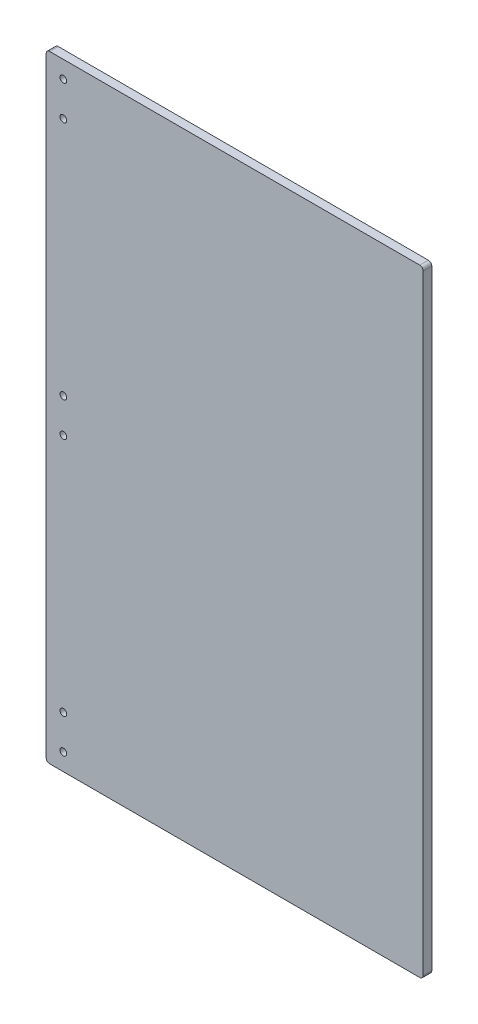
ISO-10303-21;
HEADER;
FILE_DESCRIPTION(('STEP AP214'),'2;1');
FILE_NAME('part.step','',(''),(''),'','','');
FILE_SCHEMA(('AUTOMOTIVE_DESIGN { 1 0 10303 214 1 1 1 1 }'));
ENDSEC;
DATA;
#1=APPLICATION_CONTEXT('core data for automotive mechanical design processes');
#2=APPLICATION_PROTOCOL_DEFINITION('international standard','automotive_design',2000,#1);
#3=PRODUCT_CONTEXT('',#1,'mechanical');
#4=PRODUCT('Part','Part','',(#3));
#5=PRODUCT_RELATED_PRODUCT_CATEGORY('part','',(#4));
#6=PRODUCT_DEFINITION_FORMATION('','',#4);
#7=PRODUCT_DEFINITION_CONTEXT('part definition',#1,'design');
#8=PRODUCT_DEFINITION('design','',#6,#7);
#9=PRODUCT_DEFINITION_SHAPE('','',#8);
#10=(LENGTH_UNIT() NAMED_UNIT(*) SI_UNIT(.MILLI.,.METRE.));
#11=(NAMED_UNIT(*) PLANE_ANGLE_UNIT() SI_UNIT($,.RADIAN.));
#12=(NAMED_UNIT(*) SI_UNIT($,.STERADIAN.) SOLID_ANGLE_UNIT());
#13=UNCERTAINTY_MEASURE_WITH_UNIT(LENGTH_MEASURE(1.E-05),#10,'distance_accuracy_value','');
#14=(GEOMETRIC_REPRESENTATION_CONTEXT(3) GLOBAL_UNCERTAINTY_ASSIGNED_CONTEXT((#13)) GLOBAL_UNIT_ASSIGNED_CONTEXT((#10,
#11,#12)) REPRESENTATION_CONTEXT('',''));
#15=CARTESIAN_POINT('',(0.,0.,0.));
#16=DIRECTION('',(0.,0.,1.));
#17=DIRECTION('',(1.,0.,0.));
#18=AXIS2_PLACEMENT_3D('',#15,#16,#17);
#19=CARTESIAN_POINT('',(0.,0.,6.35));
#20=DIRECTION('',(0.,0.,-1.));
#21=DIRECTION('',(-1.,0.,0.));
#22=AXIS2_PLACEMENT_3D('',#19,#20,#21);
#23=PLANE('',#22);
#24=DIRECTION('',(-1.,0.,0.));
#25=VECTOR('',#24,1.);
#26=CARTESIAN_POINT('',(0.,457.2,6.35));
#27=LINE('',#26,#25);
#28=CARTESIAN_POINT('',(276.86,457.2,6.35));
#29=VERTEX_POINT('',#28);
#30=CARTESIAN_POINT('',(2.53999999999992,457.2,6.35));
#31=VERTEX_POINT('',#30);
#32=EDGE_CURVE('E136',#29,#31,#27,.T.);
#33=ORIENTED_EDGE('',*,*,#32,.T.);
#34=CARTESIAN_POINT('',(2.53999999999992,454.66,6.35));
#35=DIRECTION('',(0.,0.,-1.));
#36=DIRECTION('',(-1.,0.,0.));
#37=AXIS2_PLACEMENT_3D('',#34,#35,#36);
#38=CIRCLE('',#37,2.54);
#39=CARTESIAN_POINT('',(0.,454.66,6.35));
#40=VERTEX_POINT('',#39);
#41=EDGE_CURVE('E155',#31,#40,#38,.F.);
#42=ORIENTED_EDGE('',*,*,#41,.T.);
#43=DIRECTION('',(0.,-1.,0.));
#44=VECTOR('',#43,1.);
#45=CARTESIAN_POINT('',(0.,0.,6.35));
#46=LINE('',#45,#44);
#47=CARTESIAN_POINT('',(0.,2.54,6.35));
#48=VERTEX_POINT('',#47);
#49=EDGE_CURVE('E119',#40,#48,#46,.T.);
#50=ORIENTED_EDGE('',*,*,#49,.T.);
#51=CARTESIAN_POINT('',(2.54,2.54,6.35));
#52=DIRECTION('',(0.,0.,-1.));
#53=DIRECTION('',(-1.,0.,0.));
#54=AXIS2_PLACEMENT_3D('',#51,#52,#53);
#55=CIRCLE('',#54,2.54);
#56=CARTESIAN_POINT('',(2.54,0.,6.35));
#57=VERTEX_POINT('',#56);
#58=EDGE_CURVE('E153',#48,#57,#55,.F.);
#59=ORIENTED_EDGE('',*,*,#58,.T.);
#60=DIRECTION('',(1.,0.,0.));
#61=VECTOR('',#60,1.);
#62=CARTESIAN_POINT('',(0.,0.,6.35));
#63=LINE('',#62,#61);
#64=CARTESIAN_POINT('',(276.86,0.,6.35));
#65=VERTEX_POINT('',#64);
#66=EDGE_CURVE('E166',#57,#65,#63,.T.);
#67=ORIENTED_EDGE('',*,*,#66,.T.);
#68=CARTESIAN_POINT('',(276.86,2.54,6.35));
#69=DIRECTION('',(0.,0.,-1.));
#70=DIRECTION('',(-1.,0.,0.));
#71=AXIS2_PLACEMENT_3D('',#68,#69,#70);
#72=CIRCLE('',#71,2.54);
#73=CARTESIAN_POINT('',(279.4,2.54,6.35));
#74=VERTEX_POINT('',#73);
#75=EDGE_CURVE('E54',#65,#74,#72,.F.);
#76=ORIENTED_EDGE('',*,*,#75,.T.);
#77=DIRECTION('',(0.,1.,0.));
#78=VECTOR('',#77,1.);
#79=CARTESIAN_POINT('',(279.4,0.,6.35));
#80=LINE('',#79,#78);
#81=CARTESIAN_POINT('',(279.4,454.66,6.35));
#82=VERTEX_POINT('',#81);
#83=EDGE_CURVE('E174',#74,#82,#80,.T.);
#84=ORIENTED_EDGE('',*,*,#83,.T.);
#85=CARTESIAN_POINT('',(276.86,454.66,6.35));
#86=DIRECTION('',(0.,0.,-1.));
#87=DIRECTION('',(-1.,0.,0.));
#88=AXIS2_PLACEMENT_3D('',#85,#86,#87);
#89=CIRCLE('',#88,2.54);
#90=EDGE_CURVE('E150',#82,#29,#89,.F.);
#91=ORIENTED_EDGE('',*,*,#90,.T.);
#92=EDGE_LOOP('',(#33,#42,#50,#59,#67,#76,#84,#91));
#93=FACE_BOUND('',#92,.T.);
#94=CARTESIAN_POINT('',(12.6999999999999,444.5,6.35));
#95=DIRECTION('',(0.,0.,1.));
#96=DIRECTION('',(1.,0.,0.));
#97=AXIS2_PLACEMENT_3D('',#94,#95,#96);
#98=CIRCLE('',#97,2.5);
#99=CARTESIAN_POINT('',(15.1999999999999,444.5,6.35));
#100=VERTEX_POINT('',#99);
#101=EDGE_CURVE('E127',#100,#100,#98,.T.);
#102=ORIENTED_EDGE('',*,*,#101,.F.);
#103=EDGE_LOOP('',(#102));
#104=FACE_BOUND('',#103,.T.);
#105=CARTESIAN_POINT('',(12.6999999999999,419.1,6.35));
#106=DIRECTION('',(0.,0.,1.));
#107=DIRECTION('',(1.,0.,0.));
#108=AXIS2_PLACEMENT_3D('',#105,#106,#107);
#109=CIRCLE('',#108,2.5);
#110=CARTESIAN_POINT('',(15.1999999999999,419.1,6.35));
#111=VERTEX_POINT('',#110);
#112=EDGE_CURVE('E181',#111,#111,#109,.T.);
#113=ORIENTED_EDGE('',*,*,#112,.F.);
#114=EDGE_LOOP('',(#113));
#115=FACE_BOUND('',#114,.T.);
#116=CARTESIAN_POINT('',(12.6999999999999,241.3,6.35));
#117=DIRECTION('',(0.,0.,1.));
#118=DIRECTION('',(1.,0.,0.));
#119=AXIS2_PLACEMENT_3D('',#116,#117,#118);
#120=CIRCLE('',#119,2.5);
#121=CARTESIAN_POINT('',(15.1999999999999,241.3,6.35));
#122=VERTEX_POINT('',#121);
#123=EDGE_CURVE('E186',#122,#122,#120,.T.);
#124=ORIENTED_EDGE('',*,*,#123,.F.);
#125=EDGE_LOOP('',(#124));
#126=FACE_BOUND('',#125,.T.);
#127=CARTESIAN_POINT('',(12.6999999999999,215.9,6.35));
#128=DIRECTION('',(0.,0.,1.));
#129=DIRECTION('',(1.,0.,0.));
#130=AXIS2_PLACEMENT_3D('',#127,#128,#129);
#131=CIRCLE('',#130,2.5);
#132=CARTESIAN_POINT('',(15.1999999999999,215.9,6.35));
#133=VERTEX_POINT('',#132);
#134=EDGE_CURVE('E192',#133,#133,#131,.T.);
#135=ORIENTED_EDGE('',*,*,#134,.F.);
#136=EDGE_LOOP('',(#135));
#137=FACE_BOUND('',#136,.T.);
#138=CARTESIAN_POINT('',(12.7,38.1,6.35));
#139=DIRECTION('',(0.,0.,1.));
#140=DIRECTION('',(1.,0.,0.));
#141=AXIS2_PLACEMENT_3D('',#138,#139,#140);
#142=CIRCLE('',#141,2.5);
#143=CARTESIAN_POINT('',(15.2,38.1,6.35));
#144=VERTEX_POINT('',#143);
#145=EDGE_CURVE('E198',#144,#144,#142,.T.);
#146=ORIENTED_EDGE('',*,*,#145,.F.);
#147=EDGE_LOOP('',(#146));
#148=FACE_BOUND('',#147,.T.);
#149=CARTESIAN_POINT('',(12.7,12.7,6.35));
#150=DIRECTION('',(0.,0.,1.));
#151=DIRECTION('',(1.,0.,0.));
#152=AXIS2_PLACEMENT_3D('',#149,#150,#151);
#153=CIRCLE('',#152,2.5);
#154=CARTESIAN_POINT('',(15.2,12.7,6.35));
#155=VERTEX_POINT('',#154);
#156=EDGE_CURVE('E204',#155,#155,#153,.T.);
#157=ORIENTED_EDGE('',*,*,#156,.F.);
#158=EDGE_LOOP('',(#157));
#159=FACE_BOUND('',#158,.T.);
#160=ADVANCED_FACE('F33',(#93,#104,#115,#126,#137,#148,#159),#23,.F.);
#161=CARTESIAN_POINT('',(0.,0.,0.));
#162=DIRECTION('',(0.,0.,-1.));
#163=DIRECTION('',(-1.,0.,0.));
#164=AXIS2_PLACEMENT_3D('',#161,#162,#163);
#165=PLANE('',#164);
#166=CARTESIAN_POINT('',(12.7,38.1,0.));
#167=DIRECTION('',(0.,0.,1.));
#168=DIRECTION('',(1.,0.,0.));
#169=AXIS2_PLACEMENT_3D('',#166,#167,#168);
#170=CIRCLE('',#169,2.5);
#171=CARTESIAN_POINT('',(15.2,38.1,0.));
#172=VERTEX_POINT('',#171);
#173=EDGE_CURVE('E201',#172,#172,#170,.T.);
#174=ORIENTED_EDGE('',*,*,#173,.T.);
#175=EDGE_LOOP('',(#174));
#176=FACE_BOUND('',#175,.T.);
#177=CARTESIAN_POINT('',(12.6999999999999,241.3,0.));
#178=DIRECTION('',(0.,0.,1.));
#179=DIRECTION('',(1.,0.,0.));
#180=AXIS2_PLACEMENT_3D('',#177,#178,#179);
#181=CIRCLE('',#180,2.5);
#182=CARTESIAN_POINT('',(15.1999999999999,241.3,0.));
#183=VERTEX_POINT('',#182);
#184=EDGE_CURVE('E189',#183,#183,#181,.T.);
#185=ORIENTED_EDGE('',*,*,#184,.T.);
#186=EDGE_LOOP('',(#185));
#187=FACE_BOUND('',#186,.T.);
#188=CARTESIAN_POINT('',(12.6999999999999,444.5,0.));
#189=DIRECTION('',(0.,0.,1.));
#190=DIRECTION('',(1.,0.,0.));
#191=AXIS2_PLACEMENT_3D('',#188,#189,#190);
#192=CIRCLE('',#191,2.5);
#193=CARTESIAN_POINT('',(15.1999999999999,444.5,0.));
#194=VERTEX_POINT('',#193);
#195=EDGE_CURVE('E133',#194,#194,#192,.T.);
#196=ORIENTED_EDGE('',*,*,#195,.T.);
#197=EDGE_LOOP('',(#196));
#198=FACE_BOUND('',#197,.T.);
#199=DIRECTION('',(0.,-1.,0.));
#200=VECTOR('',#199,1.);
#201=CARTESIAN_POINT('',(0.,0.,0.));
#202=LINE('',#201,#200);
#203=CARTESIAN_POINT('',(0.,454.66,0.));
#204=VERTEX_POINT('',#203);
#205=CARTESIAN_POINT('',(0.,2.54,0.));
#206=VERTEX_POINT('',#205);
#207=EDGE_CURVE('E116',#204,#206,#202,.T.);
#208=ORIENTED_EDGE('',*,*,#207,.F.);
#209=CARTESIAN_POINT('',(2.53999999999992,454.66,0.));
#210=DIRECTION('',(0.,0.,-1.));
#211=DIRECTION('',(-1.,0.,0.));
#212=AXIS2_PLACEMENT_3D('',#209,#210,#211);
#213=CIRCLE('',#212,2.54);
#214=CARTESIAN_POINT('',(2.53999999999992,457.2,0.));
#215=VERTEX_POINT('',#214);
#216=EDGE_CURVE('E99',#204,#215,#213,.T.);
#217=ORIENTED_EDGE('',*,*,#216,.T.);
#218=DIRECTION('',(-1.,0.,0.));
#219=VECTOR('',#218,1.);
#220=CARTESIAN_POINT('',(0.,457.2,0.));
#221=LINE('',#220,#219);
#222=CARTESIAN_POINT('',(276.86,457.2,0.));
#223=VERTEX_POINT('',#222);
#224=EDGE_CURVE('E140',#223,#215,#221,.T.);
#225=ORIENTED_EDGE('',*,*,#224,.F.);
#226=CARTESIAN_POINT('',(276.86,454.66,0.));
#227=DIRECTION('',(0.,0.,-1.));
#228=DIRECTION('',(-1.,0.,0.));
#229=AXIS2_PLACEMENT_3D('',#226,#227,#228);
#230=CIRCLE('',#229,2.54);
#231=CARTESIAN_POINT('',(279.4,454.66,0.));
#232=VERTEX_POINT('',#231);
#233=EDGE_CURVE('E120',#223,#232,#230,.T.);
#234=ORIENTED_EDGE('',*,*,#233,.T.);
#235=DIRECTION('',(0.,1.,0.));
#236=VECTOR('',#235,1.);
#237=CARTESIAN_POINT('',(279.4,0.,0.));
#238=LINE('',#237,#236);
#239=CARTESIAN_POINT('',(279.4,2.54,0.));
#240=VERTEX_POINT('',#239);
#241=EDGE_CURVE('E130',#240,#232,#238,.T.);
#242=ORIENTED_EDGE('',*,*,#241,.F.);
#243=CARTESIAN_POINT('',(276.86,2.54,0.));
#244=DIRECTION('',(0.,0.,-1.));
#245=DIRECTION('',(-1.,0.,0.));
#246=AXIS2_PLACEMENT_3D('',#243,#244,#245);
#247=CIRCLE('',#246,2.54);
#248=CARTESIAN_POINT('',(276.86,0.,0.));
#249=VERTEX_POINT('',#248);
#250=EDGE_CURVE('E144',#240,#249,#247,.T.);
#251=ORIENTED_EDGE('',*,*,#250,.T.);
#252=DIRECTION('',(1.,0.,0.));
#253=VECTOR('',#252,1.);
#254=CARTESIAN_POINT('',(0.,0.,0.));
#255=LINE('',#254,#253);
#256=CARTESIAN_POINT('',(2.54,0.,0.));
#257=VERTEX_POINT('',#256);
#258=EDGE_CURVE('E126',#257,#249,#255,.T.);
#259=ORIENTED_EDGE('',*,*,#258,.F.);
#260=CARTESIAN_POINT('',(2.54,2.54,0.));
#261=DIRECTION('',(0.,0.,-1.));
#262=DIRECTION('',(-1.,0.,0.));
#263=AXIS2_PLACEMENT_3D('',#260,#261,#262);
#264=CIRCLE('',#263,2.54);
#265=EDGE_CURVE('E110',#257,#206,#264,.T.);
#266=ORIENTED_EDGE('',*,*,#265,.T.);
#267=EDGE_LOOP('',(#208,#217,#225,#234,#242,#251,#259,#266));
#268=FACE_BOUND('',#267,.T.);
#269=CARTESIAN_POINT('',(12.6999999999999,419.1,0.));
#270=DIRECTION('',(0.,0.,1.));
#271=DIRECTION('',(1.,0.,0.));
#272=AXIS2_PLACEMENT_3D('',#269,#270,#271);
#273=CIRCLE('',#272,2.5);
#274=CARTESIAN_POINT('',(15.1999999999999,419.1,0.));
#275=VERTEX_POINT('',#274);
#276=EDGE_CURVE('E183',#275,#275,#273,.T.);
#277=ORIENTED_EDGE('',*,*,#276,.T.);
#278=EDGE_LOOP('',(#277));
#279=FACE_BOUND('',#278,.T.);
#280=CARTESIAN_POINT('',(12.6999999999999,215.9,0.));
#281=DIRECTION('',(0.,0.,1.));
#282=DIRECTION('',(1.,0.,0.));
#283=AXIS2_PLACEMENT_3D('',#280,#281,#282);
#284=CIRCLE('',#283,2.5);
#285=CARTESIAN_POINT('',(15.1999999999999,215.9,0.));
#286=VERTEX_POINT('',#285);
#287=EDGE_CURVE('E195',#286,#286,#284,.T.);
#288=ORIENTED_EDGE('',*,*,#287,.T.);
#289=EDGE_LOOP('',(#288));
#290=FACE_BOUND('',#289,.T.);
#291=CARTESIAN_POINT('',(12.7,12.7,0.));
#292=DIRECTION('',(0.,0.,1.));
#293=DIRECTION('',(1.,0.,0.));
#294=AXIS2_PLACEMENT_3D('',#291,#292,#293);
#295=CIRCLE('',#294,2.5);
#296=CARTESIAN_POINT('',(15.2,12.7,0.));
#297=VERTEX_POINT('',#296);
#298=EDGE_CURVE('E207',#297,#297,#295,.T.);
#299=ORIENTED_EDGE('',*,*,#298,.T.);
#300=EDGE_LOOP('',(#299));
#301=FACE_BOUND('',#300,.T.);
#302=ADVANCED_FACE('F123',(#176,#187,#198,#268,#279,#290,#301),#165,.T.);
#303=CARTESIAN_POINT('',(0.,0.,6.35));
#304=DIRECTION('',(1.,0.,0.));
#305=DIRECTION('',(0.,1.,0.));
#306=AXIS2_PLACEMENT_3D('',#303,#304,#305);
#307=PLANE('',#306);
#308=ORIENTED_EDGE('',*,*,#49,.F.);
#309=DIRECTION('',(0.,0.,-1.));
#310=VECTOR('',#309,1.);
#311=CARTESIAN_POINT('',(0.,454.66,6.35));
#312=LINE('',#311,#310);
#313=EDGE_CURVE('E103',#40,#204,#312,.T.);
#314=ORIENTED_EDGE('',*,*,#313,.T.);
#315=ORIENTED_EDGE('',*,*,#207,.T.);
#316=DIRECTION('',(0.,0.,-1.));
#317=VECTOR('',#316,1.);
#318=CARTESIAN_POINT('',(0.,2.54,6.35));
#319=LINE('',#318,#317);
#320=EDGE_CURVE('E121',#206,#48,#319,.F.);
#321=ORIENTED_EDGE('',*,*,#320,.T.);
#322=EDGE_LOOP('',(#308,#314,#315,#321));
#323=FACE_BOUND('',#322,.T.);
#324=ADVANCED_FACE('F115',(#323),#307,.F.);
#325=CARTESIAN_POINT('',(0.,0.,6.35));
#326=DIRECTION('',(0.,1.,0.));
#327=DIRECTION('',(0.,0.,1.));
#328=AXIS2_PLACEMENT_3D('',#325,#326,#327);
#329=PLANE('',#328);
#330=ORIENTED_EDGE('',*,*,#66,.F.);
#331=DIRECTION('',(0.,0.,-1.));
#332=VECTOR('',#331,1.);
#333=CARTESIAN_POINT('',(2.54,0.,6.35));
#334=LINE('',#333,#332);
#335=EDGE_CURVE('E159',#57,#257,#334,.T.);
#336=ORIENTED_EDGE('',*,*,#335,.T.);
#337=ORIENTED_EDGE('',*,*,#258,.T.);
#338=DIRECTION('',(0.,0.,-1.));
#339=VECTOR('',#338,1.);
#340=CARTESIAN_POINT('',(276.86,0.,6.35));
#341=LINE('',#340,#339);
#342=EDGE_CURVE('E157',#249,#65,#341,.F.);
#343=ORIENTED_EDGE('',*,*,#342,.T.);
#344=EDGE_LOOP('',(#330,#336,#337,#343));
#345=FACE_BOUND('',#344,.T.);
#346=ADVANCED_FACE('F164',(#345),#329,.F.);
#347=CARTESIAN_POINT('',(279.4,0.,6.35));
#348=DIRECTION('',(-1.,0.,0.));
#349=DIRECTION('',(0.,-1.,0.));
#350=AXIS2_PLACEMENT_3D('',#347,#348,#349);
#351=PLANE('',#350);
#352=ORIENTED_EDGE('',*,*,#83,.F.);
#353=DIRECTION('',(0.,0.,-1.));
#354=VECTOR('',#353,1.);
#355=CARTESIAN_POINT('',(279.4,2.54,6.35));
#356=LINE('',#355,#354);
#357=EDGE_CURVE('E11',#74,#240,#356,.T.);
#358=ORIENTED_EDGE('',*,*,#357,.T.);
#359=ORIENTED_EDGE('',*,*,#241,.T.);
#360=DIRECTION('',(0.,0.,-1.));
#361=VECTOR('',#360,1.);
#362=CARTESIAN_POINT('',(279.4,454.66,6.35));
#363=LINE('',#362,#361);
#364=EDGE_CURVE('E41',#232,#82,#363,.F.);
#365=ORIENTED_EDGE('',*,*,#364,.T.);
#366=EDGE_LOOP('',(#352,#358,#359,#365));
#367=FACE_BOUND('',#366,.T.);
#368=ADVANCED_FACE('F173',(#367),#351,.F.);
#369=CARTESIAN_POINT('',(0.,457.2,6.35));
#370=DIRECTION('',(0.,-1.,0.));
#371=DIRECTION('',(0.,0.,-1.));
#372=AXIS2_PLACEMENT_3D('',#369,#370,#371);
#373=PLANE('',#372);
#374=ORIENTED_EDGE('',*,*,#224,.T.);
#375=DIRECTION('',(0.,0.,-1.));
#376=VECTOR('',#375,1.);
#377=CARTESIAN_POINT('',(2.53999999999992,457.2,6.35));
#378=LINE('',#377,#376);
#379=EDGE_CURVE('E104',#215,#31,#378,.F.);
#380=ORIENTED_EDGE('',*,*,#379,.T.);
#381=ORIENTED_EDGE('',*,*,#32,.F.);
#382=DIRECTION('',(0.,0.,-1.));
#383=VECTOR('',#382,1.);
#384=CARTESIAN_POINT('',(276.86,457.2,6.35));
#385=LINE('',#384,#383);
#386=EDGE_CURVE('E109',#29,#223,#385,.T.);
#387=ORIENTED_EDGE('',*,*,#386,.T.);
#388=EDGE_LOOP('',(#374,#380,#381,#387));
#389=FACE_BOUND('',#388,.T.);
#390=ADVANCED_FACE('F228',(#389),#373,.F.);
#391=CARTESIAN_POINT('',(12.6999999999999,444.5,6.35));
#392=DIRECTION('',(0.,0.,-1.));
#393=DIRECTION('',(-1.,0.,0.));
#394=AXIS2_PLACEMENT_3D('',#391,#392,#393);
#395=CYLINDRICAL_SURFACE('',#394,2.5);
#396=ORIENTED_EDGE('',*,*,#101,.T.);
#397=EDGE_LOOP('',(#396));
#398=FACE_BOUND('',#397,.T.);
#399=ORIENTED_EDGE('',*,*,#195,.F.);
#400=EDGE_LOOP('',(#399));
#401=FACE_BOUND('',#400,.T.);
#402=ADVANCED_FACE('F225',(#398,#401),#395,.F.);
#403=CARTESIAN_POINT('',(12.6999999999999,419.1,6.35));
#404=DIRECTION('',(0.,0.,-1.));
#405=DIRECTION('',(-1.,0.,0.));
#406=AXIS2_PLACEMENT_3D('',#403,#404,#405);
#407=CYLINDRICAL_SURFACE('',#406,2.5);
#408=ORIENTED_EDGE('',*,*,#112,.T.);
#409=EDGE_LOOP('',(#408));
#410=FACE_BOUND('',#409,.T.);
#411=ORIENTED_EDGE('',*,*,#276,.F.);
#412=EDGE_LOOP('',(#411));
#413=FACE_BOUND('',#412,.T.);
#414=ADVANCED_FACE('F341',(#410,#413),#407,.F.);
#415=CARTESIAN_POINT('',(12.6999999999999,241.3,6.35));
#416=DIRECTION('',(0.,0.,-1.));
#417=DIRECTION('',(-1.,0.,0.));
#418=AXIS2_PLACEMENT_3D('',#415,#416,#417);
#419=CYLINDRICAL_SURFACE('',#418,2.5);
#420=ORIENTED_EDGE('',*,*,#123,.T.);
#421=EDGE_LOOP('',(#420));
#422=FACE_BOUND('',#421,.T.);
#423=ORIENTED_EDGE('',*,*,#184,.F.);
#424=EDGE_LOOP('',(#423));
#425=FACE_BOUND('',#424,.T.);
#426=ADVANCED_FACE('F331',(#422,#425),#419,.F.);
#427=CARTESIAN_POINT('',(12.6999999999999,215.9,6.35));
#428=DIRECTION('',(0.,0.,-1.));
#429=DIRECTION('',(-1.,0.,0.));
#430=AXIS2_PLACEMENT_3D('',#427,#428,#429);
#431=CYLINDRICAL_SURFACE('',#430,2.5);
#432=ORIENTED_EDGE('',*,*,#134,.T.);
#433=EDGE_LOOP('',(#432));
#434=FACE_BOUND('',#433,.T.);
#435=ORIENTED_EDGE('',*,*,#287,.F.);
#436=EDGE_LOOP('',(#435));
#437=FACE_BOUND('',#436,.T.);
#438=ADVANCED_FACE('F321',(#434,#437),#431,.F.);
#439=CARTESIAN_POINT('',(12.7,38.1,6.35));
#440=DIRECTION('',(0.,0.,-1.));
#441=DIRECTION('',(-1.,0.,0.));
#442=AXIS2_PLACEMENT_3D('',#439,#440,#441);
#443=CYLINDRICAL_SURFACE('',#442,2.5);
#444=ORIENTED_EDGE('',*,*,#145,.T.);
#445=EDGE_LOOP('',(#444));
#446=FACE_BOUND('',#445,.T.);
#447=ORIENTED_EDGE('',*,*,#173,.F.);
#448=EDGE_LOOP('',(#447));
#449=FACE_BOUND('',#448,.T.);
#450=ADVANCED_FACE('F312',(#446,#449),#443,.F.);
#451=CARTESIAN_POINT('',(12.7,12.7,6.35));
#452=DIRECTION('',(0.,0.,-1.));
#453=DIRECTION('',(-1.,0.,0.));
#454=AXIS2_PLACEMENT_3D('',#451,#452,#453);
#455=CYLINDRICAL_SURFACE('',#454,2.5);
#456=ORIENTED_EDGE('',*,*,#156,.T.);
#457=EDGE_LOOP('',(#456));
#458=FACE_BOUND('',#457,.T.);
#459=ORIENTED_EDGE('',*,*,#298,.F.);
#460=EDGE_LOOP('',(#459));
#461=FACE_BOUND('',#460,.T.);
#462=ADVANCED_FACE('F213',(#458,#461),#455,.F.);
#463=CARTESIAN_POINT('',(2.53999999999992,454.66,6.35));
#464=DIRECTION('',(0.,0.,-1.));
#465=DIRECTION('',(-1.,0.,0.));
#466=AXIS2_PLACEMENT_3D('',#463,#464,#465);
#467=CYLINDRICAL_SURFACE('',#466,2.54);
#468=ORIENTED_EDGE('',*,*,#41,.F.);
#469=ORIENTED_EDGE('',*,*,#379,.F.);
#470=ORIENTED_EDGE('',*,*,#216,.F.);
#471=ORIENTED_EDGE('',*,*,#313,.F.);
#472=EDGE_LOOP('',(#468,#469,#470,#471));
#473=FACE_BOUND('',#472,.T.);
#474=ADVANCED_FACE('F102',(#473),#467,.T.);
#475=CARTESIAN_POINT('',(2.54,2.54,6.35));
#476=DIRECTION('',(0.,0.,-1.));
#477=DIRECTION('',(-1.,0.,0.));
#478=AXIS2_PLACEMENT_3D('',#475,#476,#477);
#479=CYLINDRICAL_SURFACE('',#478,2.54);
#480=ORIENTED_EDGE('',*,*,#58,.F.);
#481=ORIENTED_EDGE('',*,*,#320,.F.);
#482=ORIENTED_EDGE('',*,*,#265,.F.);
#483=ORIENTED_EDGE('',*,*,#335,.F.);
#484=EDGE_LOOP('',(#480,#481,#482,#483));
#485=FACE_BOUND('',#484,.T.);
#486=ADVANCED_FACE('F240',(#485),#479,.T.);
#487=CARTESIAN_POINT('',(276.86,2.54,6.35));
#488=DIRECTION('',(0.,0.,-1.));
#489=DIRECTION('',(-1.,0.,0.));
#490=AXIS2_PLACEMENT_3D('',#487,#488,#489);
#491=CYLINDRICAL_SURFACE('',#490,2.54);
#492=ORIENTED_EDGE('',*,*,#75,.F.);
#493=ORIENTED_EDGE('',*,*,#342,.F.);
#494=ORIENTED_EDGE('',*,*,#250,.F.);
#495=ORIENTED_EDGE('',*,*,#357,.F.);
#496=EDGE_LOOP('',(#492,#493,#494,#495));
#497=FACE_BOUND('',#496,.T.);
#498=ADVANCED_FACE('F172',(#497),#491,.T.);
#499=CARTESIAN_POINT('',(276.86,454.66,6.35));
#500=DIRECTION('',(0.,0.,-1.));
#501=DIRECTION('',(-1.,0.,0.));
#502=AXIS2_PLACEMENT_3D('',#499,#500,#501);
#503=CYLINDRICAL_SURFACE('',#502,2.54);
#504=ORIENTED_EDGE('',*,*,#90,.F.);
#505=ORIENTED_EDGE('',*,*,#364,.F.);
#506=ORIENTED_EDGE('',*,*,#233,.F.);
#507=ORIENTED_EDGE('',*,*,#386,.F.);
#508=EDGE_LOOP('',(#504,#505,#506,#507));
#509=FACE_BOUND('',#508,.T.);
#510=ADVANCED_FACE('F35',(#509),#503,.T.);
#511=CLOSED_SHELL('',(#160,#302,#324,#346,#368,#390,#402,#414,#426,#438,#450,#462,#474,#486,
#498,#510));
#512=MANIFOLD_SOLID_BREP('B2',#511);
#513=ADVANCED_BREP_SHAPE_REPRESENTATION('',(#18,#512),#14);
#514=SHAPE_DEFINITION_REPRESENTATION(#9,#513);
ENDSEC;
END-ISO-10303-21;
